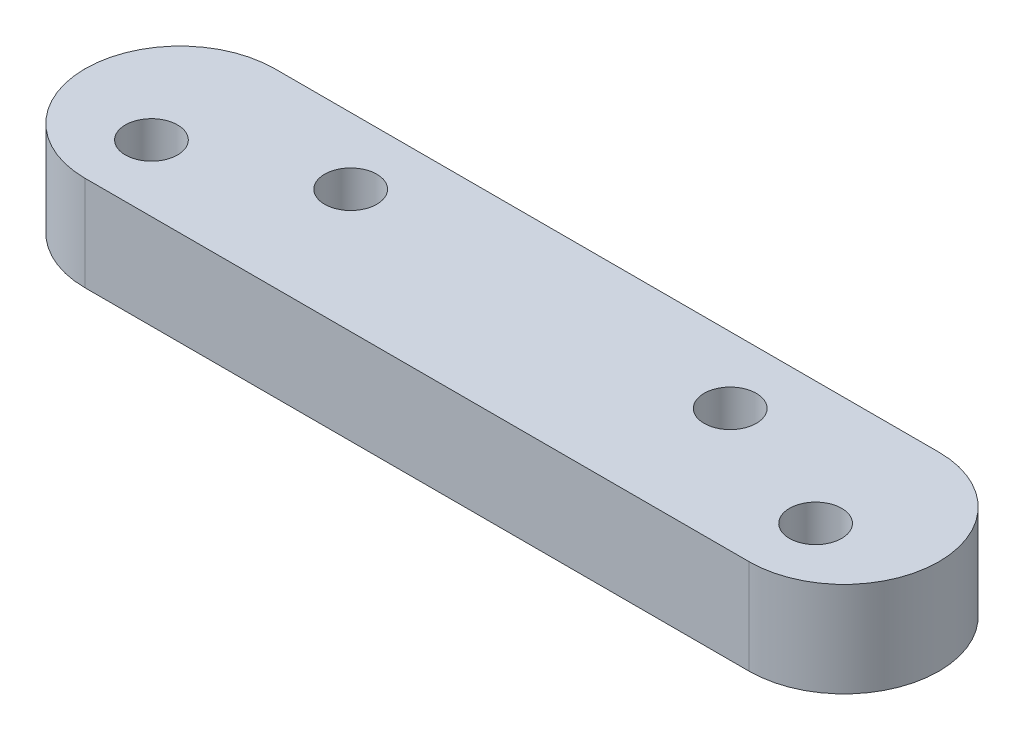
ISO-10303-21;
HEADER;
FILE_DESCRIPTION(('STEP AP214'),'2;1');
FILE_NAME('part.step','',(''),(''),'','','');
FILE_SCHEMA(('AUTOMOTIVE_DESIGN { 1 0 10303 214 1 1 1 1 }'));
ENDSEC;
DATA;
#1=APPLICATION_CONTEXT('core data for automotive mechanical design processes');
#2=APPLICATION_PROTOCOL_DEFINITION('international standard','automotive_design',2000,#1);
#3=PRODUCT_CONTEXT('',#1,'mechanical');
#4=PRODUCT('Part','Part','',(#3));
#5=PRODUCT_RELATED_PRODUCT_CATEGORY('part','',(#4));
#6=PRODUCT_DEFINITION_FORMATION('','',#4);
#7=PRODUCT_DEFINITION_CONTEXT('part definition',#1,'design');
#8=PRODUCT_DEFINITION('design','',#6,#7);
#9=PRODUCT_DEFINITION_SHAPE('','',#8);
#10=(LENGTH_UNIT() NAMED_UNIT(*) SI_UNIT(.MILLI.,.METRE.));
#11=(NAMED_UNIT(*) PLANE_ANGLE_UNIT() SI_UNIT($,.RADIAN.));
#12=(NAMED_UNIT(*) SI_UNIT($,.STERADIAN.) SOLID_ANGLE_UNIT());
#13=UNCERTAINTY_MEASURE_WITH_UNIT(LENGTH_MEASURE(1.E-05),#10,'distance_accuracy_value','');
#14=(GEOMETRIC_REPRESENTATION_CONTEXT(3) GLOBAL_UNCERTAINTY_ASSIGNED_CONTEXT((#13)) GLOBAL_UNIT_ASSIGNED_CONTEXT((#10,
#11,#12)) REPRESENTATION_CONTEXT('',''));
#15=CARTESIAN_POINT('',(0.,0.,0.));
#16=DIRECTION('',(0.,0.,1.));
#17=DIRECTION('',(1.,0.,0.));
#18=AXIS2_PLACEMENT_3D('',#15,#16,#17);
#19=CARTESIAN_POINT('',(-17.5,5.,-1.5));
#20=DIRECTION('',(0.,1.,0.));
#21=DIRECTION('',(0.,0.,1.));
#22=AXIS2_PLACEMENT_3D('',#19,#20,#21);
#23=PLANE('',#22);
#24=CARTESIAN_POINT('',(-17.5,5.,0.));
#25=DIRECTION('',(0.,1.,0.));
#26=DIRECTION('',(0.,0.,1.));
#27=AXIS2_PLACEMENT_3D('',#24,#25,#26);
#28=CIRCLE('',#27,1.375);
#29=CARTESIAN_POINT('',(-17.5,5.,1.375));
#30=VERTEX_POINT('',#29);
#31=EDGE_CURVE('E125',#30,#30,#28,.T.);
#32=ORIENTED_EDGE('',*,*,#31,.F.);
#33=EDGE_LOOP('',(#32));
#34=FACE_BOUND('',#33,.T.);
#35=CARTESIAN_POINT('',(10.,5.,-3.));
#36=DIRECTION('',(0.,1.,0.));
#37=DIRECTION('',(0.,0.,1.));
#38=AXIS2_PLACEMENT_3D('',#35,#36,#37);
#39=CIRCLE('',#38,1.375);
#40=CARTESIAN_POINT('',(10.,5.,-1.625));
#41=VERTEX_POINT('',#40);
#42=EDGE_CURVE('E104',#41,#41,#39,.T.);
#43=ORIENTED_EDGE('',*,*,#42,.F.);
#44=EDGE_LOOP('',(#43));
#45=FACE_BOUND('',#44,.T.);
#46=CARTESIAN_POINT('',(-17.5,5.,-1.5));
#47=DIRECTION('',(0.,1.,0.));
#48=DIRECTION('',(0.,0.,1.));
#49=AXIS2_PLACEMENT_3D('',#46,#47,#48);
#50=CIRCLE('',#49,5.);
#51=CARTESIAN_POINT('',(-17.5,5.,-6.5));
#52=VERTEX_POINT('',#51);
#53=CARTESIAN_POINT('',(-17.5,5.,3.5));
#54=VERTEX_POINT('',#53);
#55=EDGE_CURVE('E89',#52,#54,#50,.T.);
#56=ORIENTED_EDGE('',*,*,#55,.T.);
#57=DIRECTION('',(1.,0.,0.));
#58=VECTOR('',#57,1.);
#59=CARTESIAN_POINT('',(-17.5,5.,3.5));
#60=LINE('',#59,#58);
#61=CARTESIAN_POINT('',(17.5,5.,3.5));
#62=VERTEX_POINT('',#61);
#63=EDGE_CURVE('E84',#54,#62,#60,.T.);
#64=ORIENTED_EDGE('',*,*,#63,.T.);
#65=CARTESIAN_POINT('',(17.5,5.,-1.5));
#66=DIRECTION('',(0.,1.,0.));
#67=DIRECTION('',(0.,0.,1.));
#68=AXIS2_PLACEMENT_3D('',#65,#66,#67);
#69=CIRCLE('',#68,5.);
#70=CARTESIAN_POINT('',(17.5,5.,-6.5));
#71=VERTEX_POINT('',#70);
#72=EDGE_CURVE('E87',#62,#71,#69,.T.);
#73=ORIENTED_EDGE('',*,*,#72,.T.);
#74=DIRECTION('',(-1.,0.,0.));
#75=VECTOR('',#74,1.);
#76=CARTESIAN_POINT('',(-17.5,5.,-6.5));
#77=LINE('',#76,#75);
#78=EDGE_CURVE('E54',#71,#52,#77,.T.);
#79=ORIENTED_EDGE('',*,*,#78,.T.);
#80=EDGE_LOOP('',(#56,#64,#73,#79));
#81=FACE_BOUND('',#80,.T.);
#82=CARTESIAN_POINT('',(-10.,5.,-3.));
#83=DIRECTION('',(0.,1.,0.));
#84=DIRECTION('',(0.,0.,1.));
#85=AXIS2_PLACEMENT_3D('',#82,#83,#84);
#86=CIRCLE('',#85,1.375);
#87=CARTESIAN_POINT('',(-10.,5.,-1.625));
#88=VERTEX_POINT('',#87);
#89=EDGE_CURVE('E119',#88,#88,#86,.T.);
#90=ORIENTED_EDGE('',*,*,#89,.F.);
#91=EDGE_LOOP('',(#90));
#92=FACE_BOUND('',#91,.T.);
#93=CARTESIAN_POINT('',(17.5,5.,0.));
#94=DIRECTION('',(0.,1.,0.));
#95=DIRECTION('',(0.,0.,1.));
#96=AXIS2_PLACEMENT_3D('',#93,#94,#95);
#97=CIRCLE('',#96,1.375);
#98=CARTESIAN_POINT('',(17.5,5.,1.375));
#99=VERTEX_POINT('',#98);
#100=EDGE_CURVE('E131',#99,#99,#97,.T.);
#101=ORIENTED_EDGE('',*,*,#100,.F.);
#102=EDGE_LOOP('',(#101));
#103=FACE_BOUND('',#102,.T.);
#104=ADVANCED_FACE('F37',(#34,#45,#81,#92,#103),#23,.T.);
#105=CARTESIAN_POINT('',(-17.5,0.,-1.5));
#106=DIRECTION('',(0.,1.,0.));
#107=DIRECTION('',(0.,0.,1.));
#108=AXIS2_PLACEMENT_3D('',#105,#106,#107);
#109=PLANE('',#108);
#110=CARTESIAN_POINT('',(-17.5,0.,-1.5));
#111=DIRECTION('',(0.,1.,0.));
#112=DIRECTION('',(0.,0.,1.));
#113=AXIS2_PLACEMENT_3D('',#110,#111,#112);
#114=CIRCLE('',#113,5.);
#115=CARTESIAN_POINT('',(-17.5,0.,-6.5));
#116=VERTEX_POINT('',#115);
#117=CARTESIAN_POINT('',(-17.5,0.,3.5));
#118=VERTEX_POINT('',#117);
#119=EDGE_CURVE('E101',#116,#118,#114,.T.);
#120=ORIENTED_EDGE('',*,*,#119,.F.);
#121=DIRECTION('',(-1.,0.,0.));
#122=VECTOR('',#121,1.);
#123=CARTESIAN_POINT('',(-17.5,0.,-6.5));
#124=LINE('',#123,#122);
#125=CARTESIAN_POINT('',(17.5,0.,-6.5));
#126=VERTEX_POINT('',#125);
#127=EDGE_CURVE('E77',#126,#116,#124,.T.);
#128=ORIENTED_EDGE('',*,*,#127,.F.);
#129=CARTESIAN_POINT('',(17.5,0.,-1.5));
#130=DIRECTION('',(0.,1.,0.));
#131=DIRECTION('',(0.,0.,1.));
#132=AXIS2_PLACEMENT_3D('',#129,#130,#131);
#133=CIRCLE('',#132,5.);
#134=CARTESIAN_POINT('',(17.5,0.,3.5));
#135=VERTEX_POINT('',#134);
#136=EDGE_CURVE('E71',#135,#126,#133,.T.);
#137=ORIENTED_EDGE('',*,*,#136,.F.);
#138=DIRECTION('',(1.,0.,0.));
#139=VECTOR('',#138,1.);
#140=CARTESIAN_POINT('',(-17.5,0.,3.5));
#141=LINE('',#140,#139);
#142=EDGE_CURVE('E93',#118,#135,#141,.T.);
#143=ORIENTED_EDGE('',*,*,#142,.F.);
#144=EDGE_LOOP('',(#120,#128,#137,#143));
#145=FACE_BOUND('',#144,.T.);
#146=CARTESIAN_POINT('',(10.,0.,-3.));
#147=DIRECTION('',(0.,1.,0.));
#148=DIRECTION('',(0.,0.,1.));
#149=AXIS2_PLACEMENT_3D('',#146,#147,#148);
#150=CIRCLE('',#149,1.375);
#151=CARTESIAN_POINT('',(10.,0.,-1.625));
#152=VERTEX_POINT('',#151);
#153=EDGE_CURVE('E116',#152,#152,#150,.T.);
#154=ORIENTED_EDGE('',*,*,#153,.T.);
#155=EDGE_LOOP('',(#154));
#156=FACE_BOUND('',#155,.T.);
#157=CARTESIAN_POINT('',(-10.,0.,-3.));
#158=DIRECTION('',(0.,1.,0.));
#159=DIRECTION('',(0.,0.,1.));
#160=AXIS2_PLACEMENT_3D('',#157,#158,#159);
#161=CIRCLE('',#160,1.375);
#162=CARTESIAN_POINT('',(-10.,0.,-1.625));
#163=VERTEX_POINT('',#162);
#164=EDGE_CURVE('E122',#163,#163,#161,.T.);
#165=ORIENTED_EDGE('',*,*,#164,.T.);
#166=EDGE_LOOP('',(#165));
#167=FACE_BOUND('',#166,.T.);
#168=CARTESIAN_POINT('',(-17.5,0.,0.));
#169=DIRECTION('',(0.,1.,0.));
#170=DIRECTION('',(0.,0.,1.));
#171=AXIS2_PLACEMENT_3D('',#168,#169,#170);
#172=CIRCLE('',#171,1.375);
#173=CARTESIAN_POINT('',(-17.5,0.,1.375));
#174=VERTEX_POINT('',#173);
#175=EDGE_CURVE('E128',#174,#174,#172,.T.);
#176=ORIENTED_EDGE('',*,*,#175,.T.);
#177=EDGE_LOOP('',(#176));
#178=FACE_BOUND('',#177,.T.);
#179=CARTESIAN_POINT('',(17.5,0.,0.));
#180=DIRECTION('',(0.,1.,0.));
#181=DIRECTION('',(0.,0.,1.));
#182=AXIS2_PLACEMENT_3D('',#179,#180,#181);
#183=CIRCLE('',#182,1.375);
#184=CARTESIAN_POINT('',(17.5,0.,1.375));
#185=VERTEX_POINT('',#184);
#186=EDGE_CURVE('E134',#185,#185,#183,.T.);
#187=ORIENTED_EDGE('',*,*,#186,.T.);
#188=EDGE_LOOP('',(#187));
#189=FACE_BOUND('',#188,.T.);
#190=ADVANCED_FACE('F112',(#145,#156,#167,#178,#189),#109,.F.);
#191=CARTESIAN_POINT('',(-17.5,5.,-1.5));
#192=DIRECTION('',(0.,-1.,0.));
#193=DIRECTION('',(0.,0.,-1.));
#194=AXIS2_PLACEMENT_3D('',#191,#192,#193);
#195=CYLINDRICAL_SURFACE('',#194,5.);
#196=ORIENTED_EDGE('',*,*,#119,.T.);
#197=DIRECTION('',(0.,-1.,0.));
#198=VECTOR('',#197,1.);
#199=CARTESIAN_POINT('',(-17.5,5.,3.5));
#200=LINE('',#199,#198);
#201=EDGE_CURVE('E11',#54,#118,#200,.T.);
#202=ORIENTED_EDGE('',*,*,#201,.F.);
#203=ORIENTED_EDGE('',*,*,#55,.F.);
#204=DIRECTION('',(0.,-1.,0.));
#205=VECTOR('',#204,1.);
#206=CARTESIAN_POINT('',(-17.5,5.,-6.5));
#207=LINE('',#206,#205);
#208=EDGE_CURVE('E97',#52,#116,#207,.T.);
#209=ORIENTED_EDGE('',*,*,#208,.T.);
#210=EDGE_LOOP('',(#196,#202,#203,#209));
#211=FACE_BOUND('',#210,.T.);
#212=ADVANCED_FACE('F39',(#211),#195,.T.);
#213=CARTESIAN_POINT('',(-17.5,5.,3.5));
#214=DIRECTION('',(0.,0.,-1.));
#215=DIRECTION('',(-1.,0.,0.));
#216=AXIS2_PLACEMENT_3D('',#213,#214,#215);
#217=PLANE('',#216);
#218=ORIENTED_EDGE('',*,*,#142,.T.);
#219=DIRECTION('',(0.,-1.,0.));
#220=VECTOR('',#219,1.);
#221=CARTESIAN_POINT('',(17.5,5.,3.5));
#222=LINE('',#221,#220);
#223=EDGE_CURVE('E46',#62,#135,#222,.T.);
#224=ORIENTED_EDGE('',*,*,#223,.F.);
#225=ORIENTED_EDGE('',*,*,#63,.F.);
#226=ORIENTED_EDGE('',*,*,#201,.T.);
#227=EDGE_LOOP('',(#218,#224,#225,#226));
#228=FACE_BOUND('',#227,.T.);
#229=ADVANCED_FACE('F92',(#228),#217,.F.);
#230=CARTESIAN_POINT('',(17.5,5.,-1.5));
#231=DIRECTION('',(0.,-1.,0.));
#232=DIRECTION('',(0.,0.,-1.));
#233=AXIS2_PLACEMENT_3D('',#230,#231,#232);
#234=CYLINDRICAL_SURFACE('',#233,5.);
#235=ORIENTED_EDGE('',*,*,#136,.T.);
#236=DIRECTION('',(0.,-1.,0.));
#237=VECTOR('',#236,1.);
#238=CARTESIAN_POINT('',(17.5,5.,-6.5));
#239=LINE('',#238,#237);
#240=EDGE_CURVE('E94',#71,#126,#239,.T.);
#241=ORIENTED_EDGE('',*,*,#240,.F.);
#242=ORIENTED_EDGE('',*,*,#72,.F.);
#243=ORIENTED_EDGE('',*,*,#223,.T.);
#244=EDGE_LOOP('',(#235,#241,#242,#243));
#245=FACE_BOUND('',#244,.T.);
#246=ADVANCED_FACE('F95',(#245),#234,.T.);
#247=CARTESIAN_POINT('',(-17.5,5.,-6.5));
#248=DIRECTION('',(0.,0.,1.));
#249=DIRECTION('',(1.,0.,0.));
#250=AXIS2_PLACEMENT_3D('',#247,#248,#249);
#251=PLANE('',#250);
#252=ORIENTED_EDGE('',*,*,#127,.T.);
#253=ORIENTED_EDGE('',*,*,#208,.F.);
#254=ORIENTED_EDGE('',*,*,#78,.F.);
#255=ORIENTED_EDGE('',*,*,#240,.T.);
#256=EDGE_LOOP('',(#252,#253,#254,#255));
#257=FACE_BOUND('',#256,.T.);
#258=ADVANCED_FACE('F109',(#257),#251,.F.);
#259=CARTESIAN_POINT('',(10.,5.,-3.));
#260=DIRECTION('',(0.,-1.,0.));
#261=DIRECTION('',(0.,0.,-1.));
#262=AXIS2_PLACEMENT_3D('',#259,#260,#261);
#263=CYLINDRICAL_SURFACE('',#262,1.375);
#264=ORIENTED_EDGE('',*,*,#42,.T.);
#265=EDGE_LOOP('',(#264));
#266=FACE_BOUND('',#265,.T.);
#267=ORIENTED_EDGE('',*,*,#153,.F.);
#268=EDGE_LOOP('',(#267));
#269=FACE_BOUND('',#268,.T.);
#270=ADVANCED_FACE('F153',(#266,#269),#263,.F.);
#271=CARTESIAN_POINT('',(-10.,5.,-3.));
#272=DIRECTION('',(0.,-1.,0.));
#273=DIRECTION('',(0.,0.,-1.));
#274=AXIS2_PLACEMENT_3D('',#271,#272,#273);
#275=CYLINDRICAL_SURFACE('',#274,1.375);
#276=ORIENTED_EDGE('',*,*,#89,.T.);
#277=EDGE_LOOP('',(#276));
#278=FACE_BOUND('',#277,.T.);
#279=ORIENTED_EDGE('',*,*,#164,.F.);
#280=EDGE_LOOP('',(#279));
#281=FACE_BOUND('',#280,.T.);
#282=ADVANCED_FACE('F207',(#278,#281),#275,.F.);
#283=CARTESIAN_POINT('',(-17.5,5.,0.));
#284=DIRECTION('',(0.,-1.,0.));
#285=DIRECTION('',(0.,0.,-1.));
#286=AXIS2_PLACEMENT_3D('',#283,#284,#285);
#287=CYLINDRICAL_SURFACE('',#286,1.375);
#288=ORIENTED_EDGE('',*,*,#31,.T.);
#289=EDGE_LOOP('',(#288));
#290=FACE_BOUND('',#289,.T.);
#291=ORIENTED_EDGE('',*,*,#175,.F.);
#292=EDGE_LOOP('',(#291));
#293=FACE_BOUND('',#292,.T.);
#294=ADVANCED_FACE('F216',(#290,#293),#287,.F.);
#295=CARTESIAN_POINT('',(17.5,5.,0.));
#296=DIRECTION('',(0.,-1.,0.));
#297=DIRECTION('',(0.,0.,-1.));
#298=AXIS2_PLACEMENT_3D('',#295,#296,#297);
#299=CYLINDRICAL_SURFACE('',#298,1.375);
#300=ORIENTED_EDGE('',*,*,#100,.T.);
#301=EDGE_LOOP('',(#300));
#302=FACE_BOUND('',#301,.T.);
#303=ORIENTED_EDGE('',*,*,#186,.F.);
#304=EDGE_LOOP('',(#303));
#305=FACE_BOUND('',#304,.T.);
#306=ADVANCED_FACE('F140',(#302,#305),#299,.F.);
#307=CLOSED_SHELL('',(#104,#190,#212,#229,#246,#258,#270,#282,#294,#306));
#308=MANIFOLD_SOLID_BREP('B2',#307);
#309=ADVANCED_BREP_SHAPE_REPRESENTATION('',(#18,#308),#14);
#310=SHAPE_DEFINITION_REPRESENTATION(#9,#309);
ENDSEC;
END-ISO-10303-21;
